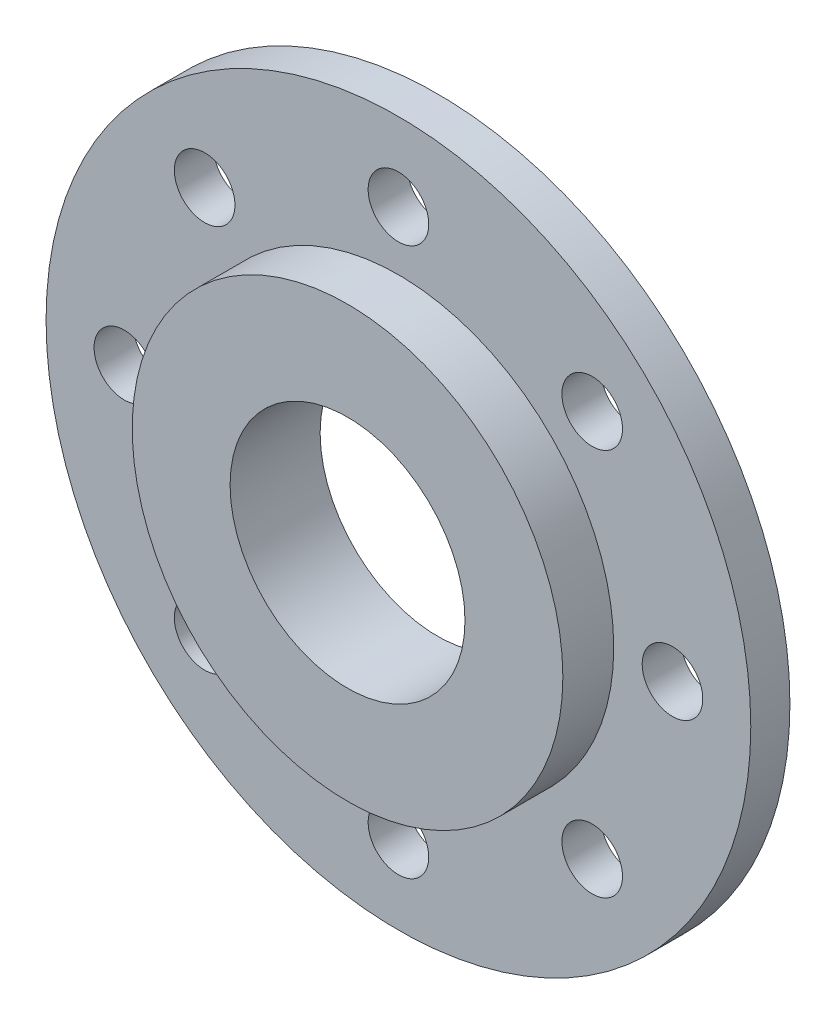
ISO-10303-21;
HEADER;
FILE_DESCRIPTION(('STEP AP214'),'2;1');
FILE_NAME('part.step','',(''),(''),'','','');
FILE_SCHEMA(('AUTOMOTIVE_DESIGN { 1 0 10303 214 1 1 1 1 }'));
ENDSEC;
DATA;
#1=APPLICATION_CONTEXT('core data for automotive mechanical design processes');
#2=APPLICATION_PROTOCOL_DEFINITION('international standard','automotive_design',2000,#1);
#3=PRODUCT_CONTEXT('',#1,'mechanical');
#4=PRODUCT('Part','Part','',(#3));
#5=PRODUCT_RELATED_PRODUCT_CATEGORY('part','',(#4));
#6=PRODUCT_DEFINITION_FORMATION('','',#4);
#7=PRODUCT_DEFINITION_CONTEXT('part definition',#1,'design');
#8=PRODUCT_DEFINITION('design','',#6,#7);
#9=PRODUCT_DEFINITION_SHAPE('','',#8);
#10=(LENGTH_UNIT() NAMED_UNIT(*) SI_UNIT(.MILLI.,.METRE.));
#11=(NAMED_UNIT(*) PLANE_ANGLE_UNIT() SI_UNIT($,.RADIAN.));
#12=(NAMED_UNIT(*) SI_UNIT($,.STERADIAN.) SOLID_ANGLE_UNIT());
#13=UNCERTAINTY_MEASURE_WITH_UNIT(LENGTH_MEASURE(1.E-05),#10,'distance_accuracy_value','');
#14=(GEOMETRIC_REPRESENTATION_CONTEXT(3) GLOBAL_UNCERTAINTY_ASSIGNED_CONTEXT((#13)) GLOBAL_UNIT_ASSIGNED_CONTEXT((#10,
#11,#12)) REPRESENTATION_CONTEXT('',''));
#15=CARTESIAN_POINT('',(0.,0.,0.));
#16=DIRECTION('',(0.,0.,1.));
#17=DIRECTION('',(1.,0.,0.));
#18=AXIS2_PLACEMENT_3D('',#15,#16,#17);
#19=CARTESIAN_POINT('',(0.,0.,4.1275));
#20=DIRECTION('',(0.,0.,-1.));
#21=DIRECTION('',(-1.,0.,0.));
#22=AXIS2_PLACEMENT_3D('',#19,#20,#21);
#23=CYLINDRICAL_SURFACE('',#22,17.4625);
#24=CARTESIAN_POINT('',(0.,0.,4.1275));
#25=DIRECTION('',(0.,0.,1.));
#26=DIRECTION('',(1.,0.,0.));
#27=AXIS2_PLACEMENT_3D('',#24,#25,#26);
#28=CIRCLE('',#27,17.4625);
#29=CARTESIAN_POINT('',(17.4625,0.,4.1275));
#30=VERTEX_POINT('',#29);
#31=EDGE_CURVE('E10',#30,#30,#28,.T.);
#32=ORIENTED_EDGE('',*,*,#31,.F.);
#33=EDGE_LOOP('',(#32));
#34=FACE_BOUND('',#33,.T.);
#35=CARTESIAN_POINT('',(0.,0.,0.));
#36=DIRECTION('',(0.,0.,1.));
#37=DIRECTION('',(1.,0.,0.));
#38=AXIS2_PLACEMENT_3D('',#35,#36,#37);
#39=CIRCLE('',#38,17.4625);
#40=CARTESIAN_POINT('',(17.4625,0.,0.));
#41=VERTEX_POINT('',#40);
#42=EDGE_CURVE('E38',#41,#41,#39,.T.);
#43=ORIENTED_EDGE('',*,*,#42,.T.);
#44=EDGE_LOOP('',(#43));
#45=FACE_BOUND('',#44,.T.);
#46=ADVANCED_FACE('F31',(#34,#45),#23,.T.);
#47=CARTESIAN_POINT('',(0.,0.,4.1275));
#48=DIRECTION('',(0.,0.,1.));
#49=DIRECTION('',(1.,0.,0.));
#50=AXIS2_PLACEMENT_3D('',#47,#48,#49);
#51=PLANE('',#50);
#52=CARTESIAN_POINT('',(0.,0.,4.1275));
#53=DIRECTION('',(0.,0.,1.));
#54=DIRECTION('',(1.,0.,0.));
#55=AXIS2_PLACEMENT_3D('',#52,#53,#54);
#56=CIRCLE('',#55,9.525);
#57=CARTESIAN_POINT('',(9.525,0.,4.1275));
#58=VERTEX_POINT('',#57);
#59=EDGE_CURVE('E134',#58,#58,#56,.F.);
#60=ORIENTED_EDGE('',*,*,#59,.T.);
#61=EDGE_LOOP('',(#60));
#62=FACE_BOUND('',#61,.T.);
#63=ORIENTED_EDGE('',*,*,#31,.T.);
#64=EDGE_LOOP('',(#63));
#65=FACE_BOUND('',#64,.T.);
#66=ADVANCED_FACE('F119',(#62,#65),#51,.T.);
#67=CARTESIAN_POINT('',(0.,0.,-3.175));
#68=DIRECTION('',(0.,0.,1.));
#69=DIRECTION('',(1.,0.,0.));
#70=AXIS2_PLACEMENT_3D('',#67,#68,#69);
#71=CYLINDRICAL_SURFACE('',#70,28.575);
#72=CARTESIAN_POINT('',(0.,0.,-3.175));
#73=DIRECTION('',(0.,0.,-1.));
#74=DIRECTION('',(-1.,0.,0.));
#75=AXIS2_PLACEMENT_3D('',#72,#73,#74);
#76=CIRCLE('',#75,28.575);
#77=CARTESIAN_POINT('',(-28.575,0.,-3.175));
#78=VERTEX_POINT('',#77);
#79=EDGE_CURVE('E43',#78,#78,#76,.T.);
#80=ORIENTED_EDGE('',*,*,#79,.F.);
#81=EDGE_LOOP('',(#80));
#82=FACE_BOUND('',#81,.T.);
#83=CARTESIAN_POINT('',(0.,0.,0.));
#84=DIRECTION('',(0.,0.,-1.));
#85=DIRECTION('',(-1.,0.,0.));
#86=AXIS2_PLACEMENT_3D('',#83,#84,#85);
#87=CIRCLE('',#86,28.575);
#88=CARTESIAN_POINT('',(-28.575,0.,0.));
#89=VERTEX_POINT('',#88);
#90=EDGE_CURVE('E46',#89,#89,#87,.T.);
#91=ORIENTED_EDGE('',*,*,#90,.T.);
#92=EDGE_LOOP('',(#91));
#93=FACE_BOUND('',#92,.T.);
#94=ADVANCED_FACE('F98',(#82,#93),#71,.T.);
#95=CARTESIAN_POINT('',(0.,0.,-3.175));
#96=DIRECTION('',(0.,0.,-1.));
#97=DIRECTION('',(-1.,0.,0.));
#98=AXIS2_PLACEMENT_3D('',#95,#96,#97);
#99=PLANE('',#98);
#100=CARTESIAN_POINT('',(0.,0.,-3.175));
#101=DIRECTION('',(0.,0.,-1.));
#102=DIRECTION('',(-1.,0.,0.));
#103=AXIS2_PLACEMENT_3D('',#100,#101,#102);
#104=CIRCLE('',#103,9.525);
#105=CARTESIAN_POINT('',(-9.525,0.,-3.175));
#106=VERTEX_POINT('',#105);
#107=EDGE_CURVE('E136',#106,#106,#104,.T.);
#108=ORIENTED_EDGE('',*,*,#107,.F.);
#109=EDGE_LOOP('',(#108));
#110=FACE_BOUND('',#109,.T.);
#111=CARTESIAN_POINT('',(-15.7154482118708,15.7154482118712,-3.175));
#112=DIRECTION('',(0.,0.,-1.));
#113=DIRECTION('',(-1.,0.,0.));
#114=AXIS2_PLACEMENT_3D('',#111,#112,#113);
#115=CIRCLE('',#114,2.45745);
#116=CARTESIAN_POINT('',(-18.1728982118708,15.7154482118712,-3.175));
#117=VERTEX_POINT('',#116);
#118=EDGE_CURVE('E139',#117,#117,#115,.T.);
#119=ORIENTED_EDGE('',*,*,#118,.F.);
#120=EDGE_LOOP('',(#119));
#121=FACE_BOUND('',#120,.T.);
#122=CARTESIAN_POINT('',(-22.225,2.32794518267366E-13,-3.175));
#123=DIRECTION('',(0.,0.,-1.));
#124=DIRECTION('',(-1.,0.,0.));
#125=AXIS2_PLACEMENT_3D('',#122,#123,#124);
#126=CIRCLE('',#125,2.45745);
#127=CARTESIAN_POINT('',(-24.68245,2.32794518267366E-13,-3.175));
#128=VERTEX_POINT('',#127);
#129=EDGE_CURVE('E63',#128,#128,#126,.T.);
#130=ORIENTED_EDGE('',*,*,#129,.F.);
#131=EDGE_LOOP('',(#130));
#132=FACE_BOUND('',#131,.T.);
#133=CARTESIAN_POINT('',(-15.7154482118712,-15.7154482118709,-3.175));
#134=DIRECTION('',(0.,0.,-1.));
#135=DIRECTION('',(-1.,0.,0.));
#136=AXIS2_PLACEMENT_3D('',#133,#134,#135);
#137=CIRCLE('',#136,2.45745);
#138=CARTESIAN_POINT('',(-18.1728982118712,-15.7154482118709,-3.175));
#139=VERTEX_POINT('',#138);
#140=EDGE_CURVE('E51',#139,#139,#137,.T.);
#141=ORIENTED_EDGE('',*,*,#140,.F.);
#142=EDGE_LOOP('',(#141));
#143=FACE_BOUND('',#142,.T.);
#144=CARTESIAN_POINT('',(0.,-22.225,-3.175));
#145=DIRECTION('',(0.,0.,-1.));
#146=DIRECTION('',(-1.,0.,0.));
#147=AXIS2_PLACEMENT_3D('',#144,#145,#146);
#148=CIRCLE('',#147,2.45745);
#149=CARTESIAN_POINT('',(-2.45745,-22.225,-3.175));
#150=VERTEX_POINT('',#149);
#151=EDGE_CURVE('E50',#150,#150,#148,.T.);
#152=ORIENTED_EDGE('',*,*,#151,.F.);
#153=EDGE_LOOP('',(#152));
#154=FACE_BOUND('',#153,.T.);
#155=CARTESIAN_POINT('',(15.7154482118709,-15.7154482118711,-3.175));
#156=DIRECTION('',(0.,0.,-1.));
#157=DIRECTION('',(-1.,0.,0.));
#158=AXIS2_PLACEMENT_3D('',#155,#156,#157);
#159=CIRCLE('',#158,2.45745);
#160=CARTESIAN_POINT('',(13.2579982118709,-15.7154482118711,-3.175));
#161=VERTEX_POINT('',#160);
#162=EDGE_CURVE('E69',#161,#161,#159,.T.);
#163=ORIENTED_EDGE('',*,*,#162,.F.);
#164=EDGE_LOOP('',(#163));
#165=FACE_BOUND('',#164,.T.);
#166=CARTESIAN_POINT('',(22.225,0.,-3.175));
#167=DIRECTION('',(0.,0.,-1.));
#168=DIRECTION('',(-1.,0.,0.));
#169=AXIS2_PLACEMENT_3D('',#166,#167,#168);
#170=CIRCLE('',#169,2.45745);
#171=CARTESIAN_POINT('',(19.76755,0.,-3.175));
#172=VERTEX_POINT('',#171);
#173=EDGE_CURVE('E75',#172,#172,#170,.T.);
#174=ORIENTED_EDGE('',*,*,#173,.F.);
#175=EDGE_LOOP('',(#174));
#176=FACE_BOUND('',#175,.T.);
#177=CARTESIAN_POINT('',(15.715448211871,15.715448211871,-3.175));
#178=DIRECTION('',(0.,0.,-1.));
#179=DIRECTION('',(-1.,0.,0.));
#180=AXIS2_PLACEMENT_3D('',#177,#178,#179);
#181=CIRCLE('',#180,2.45745);
#182=CARTESIAN_POINT('',(13.257998211871,15.715448211871,-3.175));
#183=VERTEX_POINT('',#182);
#184=EDGE_CURVE('E81',#183,#183,#181,.T.);
#185=ORIENTED_EDGE('',*,*,#184,.F.);
#186=EDGE_LOOP('',(#185));
#187=FACE_BOUND('',#186,.T.);
#188=CARTESIAN_POINT('',(0.,22.225,-3.175));
#189=DIRECTION('',(0.,0.,-1.));
#190=DIRECTION('',(-1.,0.,0.));
#191=AXIS2_PLACEMENT_3D('',#188,#189,#190);
#192=CIRCLE('',#191,2.45745);
#193=CARTESIAN_POINT('',(-2.45745,22.225,-3.175));
#194=VERTEX_POINT('',#193);
#195=EDGE_CURVE('E87',#194,#194,#192,.T.);
#196=ORIENTED_EDGE('',*,*,#195,.F.);
#197=EDGE_LOOP('',(#196));
#198=FACE_BOUND('',#197,.T.);
#199=ORIENTED_EDGE('',*,*,#79,.T.);
#200=EDGE_LOOP('',(#199));
#201=FACE_BOUND('',#200,.T.);
#202=ADVANCED_FACE('F103',(#110,#121,#132,#143,#154,#165,#176,#187,#198,#201),#99,.T.);
#203=CARTESIAN_POINT('',(0.,0.,0.));
#204=DIRECTION('',(0.,0.,-1.));
#205=DIRECTION('',(-1.,0.,0.));
#206=AXIS2_PLACEMENT_3D('',#203,#204,#205);
#207=PLANE('',#206);
#208=CARTESIAN_POINT('',(-15.7154482118708,15.7154482118712,0.));
#209=DIRECTION('',(0.,0.,-1.));
#210=DIRECTION('',(-1.,0.,0.));
#211=AXIS2_PLACEMENT_3D('',#208,#209,#210);
#212=CIRCLE('',#211,2.45745);
#213=CARTESIAN_POINT('',(-18.1728982118708,15.7154482118712,0.));
#214=VERTEX_POINT('',#213);
#215=EDGE_CURVE('E34',#214,#214,#212,.T.);
#216=ORIENTED_EDGE('',*,*,#215,.T.);
#217=EDGE_LOOP('',(#216));
#218=FACE_BOUND('',#217,.T.);
#219=CARTESIAN_POINT('',(-22.225,2.32794518267366E-13,0.));
#220=DIRECTION('',(0.,0.,-1.));
#221=DIRECTION('',(-1.,0.,0.));
#222=AXIS2_PLACEMENT_3D('',#219,#220,#221);
#223=CIRCLE('',#222,2.45745);
#224=CARTESIAN_POINT('',(-24.68245,2.32794518267366E-13,0.));
#225=VERTEX_POINT('',#224);
#226=EDGE_CURVE('E58',#225,#225,#223,.T.);
#227=ORIENTED_EDGE('',*,*,#226,.T.);
#228=EDGE_LOOP('',(#227));
#229=FACE_BOUND('',#228,.T.);
#230=CARTESIAN_POINT('',(-15.7154482118712,-15.7154482118709,0.));
#231=DIRECTION('',(0.,0.,-1.));
#232=DIRECTION('',(-1.,0.,0.));
#233=AXIS2_PLACEMENT_3D('',#230,#231,#232);
#234=CIRCLE('',#233,2.45745);
#235=CARTESIAN_POINT('',(-18.1728982118712,-15.7154482118709,0.));
#236=VERTEX_POINT('',#235);
#237=EDGE_CURVE('E48',#236,#236,#234,.T.);
#238=ORIENTED_EDGE('',*,*,#237,.T.);
#239=EDGE_LOOP('',(#238));
#240=FACE_BOUND('',#239,.T.);
#241=CARTESIAN_POINT('',(0.,-22.225,0.));
#242=DIRECTION('',(0.,0.,-1.));
#243=DIRECTION('',(-1.,0.,0.));
#244=AXIS2_PLACEMENT_3D('',#241,#242,#243);
#245=CIRCLE('',#244,2.45745);
#246=CARTESIAN_POINT('',(-2.45745,-22.225,0.));
#247=VERTEX_POINT('',#246);
#248=EDGE_CURVE('E55',#247,#247,#245,.T.);
#249=ORIENTED_EDGE('',*,*,#248,.T.);
#250=EDGE_LOOP('',(#249));
#251=FACE_BOUND('',#250,.T.);
#252=CARTESIAN_POINT('',(15.7154482118709,-15.7154482118711,0.));
#253=DIRECTION('',(0.,0.,-1.));
#254=DIRECTION('',(-1.,0.,0.));
#255=AXIS2_PLACEMENT_3D('',#252,#253,#254);
#256=CIRCLE('',#255,2.45745);
#257=CARTESIAN_POINT('',(13.2579982118709,-15.7154482118711,0.));
#258=VERTEX_POINT('',#257);
#259=EDGE_CURVE('E72',#258,#258,#256,.T.);
#260=ORIENTED_EDGE('',*,*,#259,.T.);
#261=EDGE_LOOP('',(#260));
#262=FACE_BOUND('',#261,.T.);
#263=CARTESIAN_POINT('',(22.225,0.,0.));
#264=DIRECTION('',(0.,0.,-1.));
#265=DIRECTION('',(-1.,0.,0.));
#266=AXIS2_PLACEMENT_3D('',#263,#264,#265);
#267=CIRCLE('',#266,2.45745);
#268=CARTESIAN_POINT('',(19.76755,0.,0.));
#269=VERTEX_POINT('',#268);
#270=EDGE_CURVE('E78',#269,#269,#267,.T.);
#271=ORIENTED_EDGE('',*,*,#270,.T.);
#272=EDGE_LOOP('',(#271));
#273=FACE_BOUND('',#272,.T.);
#274=CARTESIAN_POINT('',(15.715448211871,15.715448211871,0.));
#275=DIRECTION('',(0.,0.,-1.));
#276=DIRECTION('',(-1.,0.,0.));
#277=AXIS2_PLACEMENT_3D('',#274,#275,#276);
#278=CIRCLE('',#277,2.45745);
#279=CARTESIAN_POINT('',(13.257998211871,15.715448211871,0.));
#280=VERTEX_POINT('',#279);
#281=EDGE_CURVE('E84',#280,#280,#278,.T.);
#282=ORIENTED_EDGE('',*,*,#281,.T.);
#283=EDGE_LOOP('',(#282));
#284=FACE_BOUND('',#283,.T.);
#285=CARTESIAN_POINT('',(0.,22.225,0.));
#286=DIRECTION('',(0.,0.,-1.));
#287=DIRECTION('',(-1.,0.,0.));
#288=AXIS2_PLACEMENT_3D('',#285,#286,#287);
#289=CIRCLE('',#288,2.45745);
#290=CARTESIAN_POINT('',(-2.45745,22.225,0.));
#291=VERTEX_POINT('',#290);
#292=EDGE_CURVE('E90',#291,#291,#289,.T.);
#293=ORIENTED_EDGE('',*,*,#292,.T.);
#294=EDGE_LOOP('',(#293));
#295=FACE_BOUND('',#294,.T.);
#296=ORIENTED_EDGE('',*,*,#42,.F.);
#297=EDGE_LOOP('',(#296));
#298=FACE_BOUND('',#297,.T.);
#299=ORIENTED_EDGE('',*,*,#90,.F.);
#300=EDGE_LOOP('',(#299));
#301=FACE_BOUND('',#300,.T.);
#302=ADVANCED_FACE('F100',(#218,#229,#240,#251,#262,#273,#284,#295,#298,#301),#207,.F.);
#303=CARTESIAN_POINT('',(0.,22.225,-3.175));
#304=DIRECTION('',(0.,0.,-1.));
#305=DIRECTION('',(-1.,0.,0.));
#306=AXIS2_PLACEMENT_3D('',#303,#304,#305);
#307=CYLINDRICAL_SURFACE('',#306,2.45745);
#308=ORIENTED_EDGE('',*,*,#195,.T.);
#309=EDGE_LOOP('',(#308));
#310=FACE_BOUND('',#309,.T.);
#311=ORIENTED_EDGE('',*,*,#292,.F.);
#312=EDGE_LOOP('',(#311));
#313=FACE_BOUND('',#312,.T.);
#314=ADVANCED_FACE('F102',(#310,#313),#307,.F.);
#315=CARTESIAN_POINT('',(15.715448211871,15.715448211871,-3.175));
#316=DIRECTION('',(0.,0.,-1.));
#317=DIRECTION('',(-1.,0.,0.));
#318=AXIS2_PLACEMENT_3D('',#315,#316,#317);
#319=CYLINDRICAL_SURFACE('',#318,2.45745);
#320=ORIENTED_EDGE('',*,*,#184,.T.);
#321=EDGE_LOOP('',(#320));
#322=FACE_BOUND('',#321,.T.);
#323=ORIENTED_EDGE('',*,*,#281,.F.);
#324=EDGE_LOOP('',(#323));
#325=FACE_BOUND('',#324,.T.);
#326=ADVANCED_FACE('F110',(#322,#325),#319,.F.);
#327=CARTESIAN_POINT('',(22.225,0.,-3.175));
#328=DIRECTION('',(0.,0.,-1.));
#329=DIRECTION('',(-1.,0.,0.));
#330=AXIS2_PLACEMENT_3D('',#327,#328,#329);
#331=CYLINDRICAL_SURFACE('',#330,2.45745);
#332=ORIENTED_EDGE('',*,*,#173,.T.);
#333=EDGE_LOOP('',(#332));
#334=FACE_BOUND('',#333,.T.);
#335=ORIENTED_EDGE('',*,*,#270,.F.);
#336=EDGE_LOOP('',(#335));
#337=FACE_BOUND('',#336,.T.);
#338=ADVANCED_FACE('F171',(#334,#337),#331,.F.);
#339=CARTESIAN_POINT('',(15.7154482118709,-15.7154482118711,-3.175));
#340=DIRECTION('',(0.,0.,-1.));
#341=DIRECTION('',(-1.,0.,0.));
#342=AXIS2_PLACEMENT_3D('',#339,#340,#341);
#343=CYLINDRICAL_SURFACE('',#342,2.45745);
#344=ORIENTED_EDGE('',*,*,#162,.T.);
#345=EDGE_LOOP('',(#344));
#346=FACE_BOUND('',#345,.T.);
#347=ORIENTED_EDGE('',*,*,#259,.F.);
#348=EDGE_LOOP('',(#347));
#349=FACE_BOUND('',#348,.T.);
#350=ADVANCED_FACE('F167',(#346,#349),#343,.F.);
#351=CARTESIAN_POINT('',(0.,-22.225,-3.175));
#352=DIRECTION('',(0.,0.,-1.));
#353=DIRECTION('',(-1.,0.,0.));
#354=AXIS2_PLACEMENT_3D('',#351,#352,#353);
#355=CYLINDRICAL_SURFACE('',#354,2.45745);
#356=ORIENTED_EDGE('',*,*,#151,.T.);
#357=EDGE_LOOP('',(#356));
#358=FACE_BOUND('',#357,.T.);
#359=ORIENTED_EDGE('',*,*,#248,.F.);
#360=EDGE_LOOP('',(#359));
#361=FACE_BOUND('',#360,.T.);
#362=ADVANCED_FACE('F164',(#358,#361),#355,.F.);
#363=CARTESIAN_POINT('',(-15.7154482118712,-15.7154482118709,-3.175));
#364=DIRECTION('',(0.,0.,-1.));
#365=DIRECTION('',(-1.,0.,0.));
#366=AXIS2_PLACEMENT_3D('',#363,#364,#365);
#367=CYLINDRICAL_SURFACE('',#366,2.45745);
#368=ORIENTED_EDGE('',*,*,#140,.T.);
#369=EDGE_LOOP('',(#368));
#370=FACE_BOUND('',#369,.T.);
#371=ORIENTED_EDGE('',*,*,#237,.F.);
#372=EDGE_LOOP('',(#371));
#373=FACE_BOUND('',#372,.T.);
#374=ADVANCED_FACE('F159',(#370,#373),#367,.F.);
#375=CARTESIAN_POINT('',(-22.225,2.32794518267366E-13,-3.175));
#376=DIRECTION('',(0.,0.,-1.));
#377=DIRECTION('',(-1.,0.,0.));
#378=AXIS2_PLACEMENT_3D('',#375,#376,#377);
#379=CYLINDRICAL_SURFACE('',#378,2.45745);
#380=ORIENTED_EDGE('',*,*,#129,.T.);
#381=EDGE_LOOP('',(#380));
#382=FACE_BOUND('',#381,.T.);
#383=ORIENTED_EDGE('',*,*,#226,.F.);
#384=EDGE_LOOP('',(#383));
#385=FACE_BOUND('',#384,.T.);
#386=ADVANCED_FACE('F151',(#382,#385),#379,.F.);
#387=CARTESIAN_POINT('',(-15.7154482118708,15.7154482118712,-3.175));
#388=DIRECTION('',(0.,0.,-1.));
#389=DIRECTION('',(-1.,0.,0.));
#390=AXIS2_PLACEMENT_3D('',#387,#388,#389);
#391=CYLINDRICAL_SURFACE('',#390,2.45745);
#392=ORIENTED_EDGE('',*,*,#118,.T.);
#393=EDGE_LOOP('',(#392));
#394=FACE_BOUND('',#393,.T.);
#395=ORIENTED_EDGE('',*,*,#215,.F.);
#396=EDGE_LOOP('',(#395));
#397=FACE_BOUND('',#396,.T.);
#398=ADVANCED_FACE('F148',(#394,#397),#391,.F.);
#399=CARTESIAN_POINT('',(0.,0.,4.1285));
#400=DIRECTION('',(0.,0.,-1.));
#401=DIRECTION('',(-1.,0.,0.));
#402=AXIS2_PLACEMENT_3D('',#399,#400,#401);
#403=CYLINDRICAL_SURFACE('',#402,9.525);
#404=ORIENTED_EDGE('',*,*,#59,.F.);
#405=EDGE_LOOP('',(#404));
#406=FACE_BOUND('',#405,.T.);
#407=ORIENTED_EDGE('',*,*,#107,.T.);
#408=EDGE_LOOP('',(#407));
#409=FACE_BOUND('',#408,.T.);
#410=ADVANCED_FACE('F150',(#406,#409),#403,.F.);
#411=CLOSED_SHELL('',(#46,#66,#94,#202,#302,#314,#326,#338,#350,#362,#374,#386,#398,#410));
#412=MANIFOLD_SOLID_BREP('B2',#411);
#413=ADVANCED_BREP_SHAPE_REPRESENTATION('',(#18,#412),#14);
#414=SHAPE_DEFINITION_REPRESENTATION(#9,#413);
ENDSEC;
END-ISO-10303-21;
